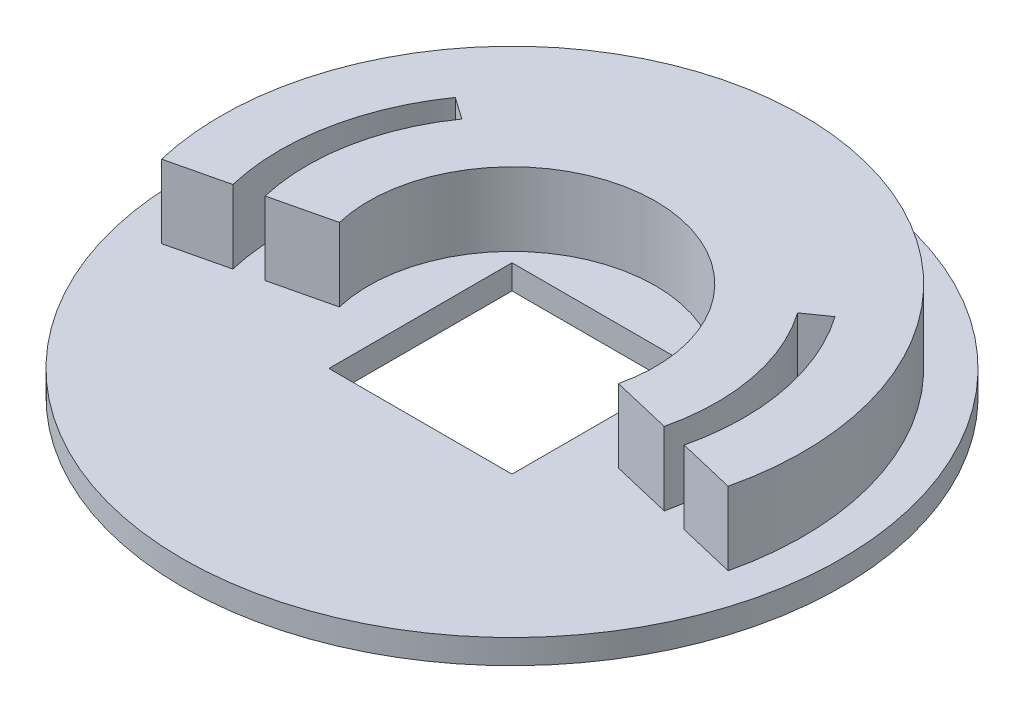
ISO-10303-21;
HEADER;
FILE_DESCRIPTION(('STEP AP214'),'2;1');
FILE_NAME('part.step','',(''),(''),'','','');
FILE_SCHEMA(('AUTOMOTIVE_DESIGN { 1 0 10303 214 1 1 1 1 }'));
ENDSEC;
DATA;
#1=APPLICATION_CONTEXT('core data for automotive mechanical design processes');
#2=APPLICATION_PROTOCOL_DEFINITION('international standard','automotive_design',2000,#1);
#3=PRODUCT_CONTEXT('',#1,'mechanical');
#4=PRODUCT('Part','Part','',(#3));
#5=PRODUCT_RELATED_PRODUCT_CATEGORY('part','',(#4));
#6=PRODUCT_DEFINITION_FORMATION('','',#4);
#7=PRODUCT_DEFINITION_CONTEXT('part definition',#1,'design');
#8=PRODUCT_DEFINITION('design','',#6,#7);
#9=PRODUCT_DEFINITION_SHAPE('','',#8);
#10=(LENGTH_UNIT() NAMED_UNIT(*) SI_UNIT(.MILLI.,.METRE.));
#11=(NAMED_UNIT(*) PLANE_ANGLE_UNIT() SI_UNIT($,.RADIAN.));
#12=(NAMED_UNIT(*) SI_UNIT($,.STERADIAN.) SOLID_ANGLE_UNIT());
#13=UNCERTAINTY_MEASURE_WITH_UNIT(LENGTH_MEASURE(1.E-05),#10,'distance_accuracy_value','');
#14=(GEOMETRIC_REPRESENTATION_CONTEXT(3) GLOBAL_UNCERTAINTY_ASSIGNED_CONTEXT((#13)) GLOBAL_UNIT_ASSIGNED_CONTEXT((#10,
#11,#12)) REPRESENTATION_CONTEXT('',''));
#15=CARTESIAN_POINT('',(0.,0.,0.));
#16=DIRECTION('',(0.,0.,1.));
#17=DIRECTION('',(1.,0.,0.));
#18=AXIS2_PLACEMENT_3D('',#15,#16,#17);
#19=CARTESIAN_POINT('',(23.207164841919,6.,5.5));
#20=DIRECTION('',(-0.230607966457023,0.,0.973046743895974));
#21=DIRECTION('',(0.973046743895974,0.,0.230607966457023));
#22=AXIS2_PLACEMENT_3D('',#19,#20,#21);
#23=PLANE('',#22);
#24=DIRECTION('',(-0.973046743895974,0.,-0.230607966457023));
#25=VECTOR('',#24,1.);
#26=CARTESIAN_POINT('',(23.207164841919,6.,5.5));
#27=LINE('',#26,#25);
#28=CARTESIAN_POINT('',(23.207164841919,6.,5.50000000000002));
#29=VERTEX_POINT('',#28);
#30=CARTESIAN_POINT('',(18.4878881340235,6.,4.38155136268344));
#31=VERTEX_POINT('',#30);
#32=EDGE_CURVE('E285',#29,#31,#27,.T.);
#33=ORIENTED_EDGE('',*,*,#32,.T.);
#34=DIRECTION('',(0.,1.,0.));
#35=VECTOR('',#34,1.);
#36=CARTESIAN_POINT('',(18.4878881340235,-16.1661900041716,4.38155136268344));
#37=LINE('',#36,#35);
#38=CARTESIAN_POINT('',(18.4878881340235,0.,4.38155136268344));
#39=VERTEX_POINT('',#38);
#40=EDGE_CURVE('E186',#39,#31,#37,.T.);
#41=ORIENTED_EDGE('',*,*,#40,.F.);
#42=DIRECTION('',(-0.973046743895974,0.,-0.230607966457023));
#43=VECTOR('',#42,1.);
#44=CARTESIAN_POINT('',(23.207164841919,0.,5.5));
#45=LINE('',#44,#43);
#46=CARTESIAN_POINT('',(23.207164841919,0.,5.50000000000002));
#47=VERTEX_POINT('',#46);
#48=EDGE_CURVE('E303',#47,#39,#45,.T.);
#49=ORIENTED_EDGE('',*,*,#48,.F.);
#50=DIRECTION('',(0.,-1.,0.));
#51=VECTOR('',#50,1.);
#52=CARTESIAN_POINT('',(23.207164841919,6.,5.50000000000002));
#53=LINE('',#52,#51);
#54=EDGE_CURVE('E312',#29,#47,#53,.T.);
#55=ORIENTED_EDGE('',*,*,#54,.F.);
#56=EDGE_LOOP('',(#33,#41,#49,#55));
#57=FACE_BOUND('',#56,.T.);
#58=ADVANCED_FACE('F39',(#57),#23,.T.);
#59=CARTESIAN_POINT('',(16.3471852974524,0.,3.87421383647799));
#60=VERTEX_POINT('',#59);
#61=CARTESIAN_POINT('',(11.4332992407777,0.,2.70964360587002));
#62=VERTEX_POINT('',#61);
#63=EDGE_CURVE('E302',#60,#62,#45,.T.);
#64=ORIENTED_EDGE('',*,*,#63,.F.);
#65=DIRECTION('',(0.,1.,0.));
#66=VECTOR('',#65,1.);
#67=CARTESIAN_POINT('',(16.3471852974524,-16.1661900041716,3.87421383647798));
#68=LINE('',#67,#66);
#69=CARTESIAN_POINT('',(16.3471852974524,6.,3.87421383647798));
#70=VERTEX_POINT('',#69);
#71=EDGE_CURVE('E55',#60,#70,#68,.T.);
#72=ORIENTED_EDGE('',*,*,#71,.T.);
#73=CARTESIAN_POINT('',(11.4332992407777,6.,2.70964360587002));
#74=VERTEX_POINT('',#73);
#75=EDGE_CURVE('E284',#70,#74,#27,.T.);
#76=ORIENTED_EDGE('',*,*,#75,.T.);
#77=DIRECTION('',(0.,-1.,0.));
#78=VECTOR('',#77,1.);
#79=CARTESIAN_POINT('',(11.4332992407777,6.,2.70964360587002));
#80=LINE('',#79,#78);
#81=EDGE_CURVE('E48',#74,#62,#80,.T.);
#82=ORIENTED_EDGE('',*,*,#81,.T.);
#83=EDGE_LOOP('',(#64,#72,#76,#82));
#84=FACE_BOUND('',#83,.T.);
#85=ADVANCED_FACE('F319',(#84),#23,.T.);
#86=CARTESIAN_POINT('',(0.,6.,0.));
#87=DIRECTION('',(0.,-1.,0.));
#88=DIRECTION('',(0.,0.,-1.));
#89=AXIS2_PLACEMENT_3D('',#86,#87,#88);
#90=PLANE('',#89);
#91=CARTESIAN_POINT('',(0.,6.,0.));
#92=DIRECTION('',(0.,-1.,0.));
#93=DIRECTION('',(0.,0.,-1.));
#94=AXIS2_PLACEMENT_3D('',#91,#92,#93);
#95=CIRCLE('',#94,19.);
#96=CARTESIAN_POINT('',(15.555508901638,6.,-10.909910302613));
#97=VERTEX_POINT('',#96);
#98=EDGE_CURVE('E183',#97,#31,#95,.T.);
#99=ORIENTED_EDGE('',*,*,#98,.T.);
#100=ORIENTED_EDGE('',*,*,#32,.F.);
#101=CARTESIAN_POINT('',(0.,6.,1.28369537222284E-13));
#102=DIRECTION('',(0.,-1.,0.));
#103=DIRECTION('',(0.,0.,-1.));
#104=AXIS2_PLACEMENT_3D('',#101,#102,#103);
#105=CIRCLE('',#104,23.85);
#106=CARTESIAN_POINT('',(-23.207164841919,6.,5.5));
#107=VERTEX_POINT('',#106);
#108=EDGE_CURVE('E289',#107,#29,#105,.T.);
#109=ORIENTED_EDGE('',*,*,#108,.F.);
#110=DIRECTION('',(0.973046743895974,0.,-0.230607966457023));
#111=VECTOR('',#110,1.);
#112=CARTESIAN_POINT('',(-23.207164841919,6.,5.5));
#113=LINE('',#112,#111);
#114=CARTESIAN_POINT('',(-18.4878881340235,6.,4.38155136268344));
#115=VERTEX_POINT('',#114);
#116=EDGE_CURVE('E275',#107,#115,#113,.T.);
#117=ORIENTED_EDGE('',*,*,#116,.T.);
#118=CARTESIAN_POINT('',(0.,6.,0.));
#119=DIRECTION('',(0.,1.,0.));
#120=DIRECTION('',(0.,0.,-1.));
#121=AXIS2_PLACEMENT_3D('',#118,#119,#120);
#122=CIRCLE('',#121,19.);
#123=CARTESIAN_POINT('',(-15.555508901638,6.,-10.909910302613));
#124=VERTEX_POINT('',#123);
#125=EDGE_CURVE('E175',#124,#115,#122,.T.);
#126=ORIENTED_EDGE('',*,*,#125,.F.);
#127=DIRECTION('',(-0.818710994823051,0.,-0.574205805400686));
#128=VECTOR('',#127,1.);
#129=CARTESIAN_POINT('',(-15.555508901638,6.,-10.909910302613));
#130=LINE('',#129,#128);
#131=CARTESIAN_POINT('',(-13.7543447130273,6.,-9.64665753073152));
#132=VERTEX_POINT('',#131);
#133=EDGE_CURVE('E194',#132,#124,#130,.T.);
#134=ORIENTED_EDGE('',*,*,#133,.F.);
#135=CARTESIAN_POINT('',(0.,6.,0.));
#136=DIRECTION('',(0.,-1.,0.));
#137=DIRECTION('',(0.,0.,-1.));
#138=AXIS2_PLACEMENT_3D('',#135,#136,#137);
#139=CIRCLE('',#138,16.8);
#140=CARTESIAN_POINT('',(-16.3471852974524,6.,3.87421383647798));
#141=VERTEX_POINT('',#140);
#142=EDGE_CURVE('E179',#141,#132,#139,.T.);
#143=ORIENTED_EDGE('',*,*,#142,.F.);
#144=CARTESIAN_POINT('',(-11.4332992407777,6.,2.70964360587002));
#145=VERTEX_POINT('',#144);
#146=EDGE_CURVE('E280',#141,#145,#113,.T.);
#147=ORIENTED_EDGE('',*,*,#146,.T.);
#148=CARTESIAN_POINT('',(0.,6.,0.));
#149=DIRECTION('',(0.,-1.,0.));
#150=DIRECTION('',(0.,0.,-1.));
#151=AXIS2_PLACEMENT_3D('',#148,#149,#150);
#152=CIRCLE('',#151,11.75);
#153=EDGE_CURVE('E279',#145,#74,#152,.T.);
#154=ORIENTED_EDGE('',*,*,#153,.T.);
#155=ORIENTED_EDGE('',*,*,#75,.F.);
#156=CARTESIAN_POINT('',(0.,6.,0.));
#157=DIRECTION('',(0.,1.,0.));
#158=DIRECTION('',(0.,0.,-1.));
#159=AXIS2_PLACEMENT_3D('',#156,#157,#158);
#160=CIRCLE('',#159,16.8);
#161=CARTESIAN_POINT('',(13.7543447130273,6.,-9.64665753073152));
#162=VERTEX_POINT('',#161);
#163=EDGE_CURVE('E162',#70,#162,#160,.T.);
#164=ORIENTED_EDGE('',*,*,#163,.T.);
#165=DIRECTION('',(0.818710994823051,0.,-0.574205805400686));
#166=VECTOR('',#165,1.);
#167=CARTESIAN_POINT('',(15.555508901638,6.,-10.909910302613));
#168=LINE('',#167,#166);
#169=EDGE_CURVE('E159',#162,#97,#168,.T.);
#170=ORIENTED_EDGE('',*,*,#169,.T.);
#171=EDGE_LOOP('',(#99,#100,#109,#117,#126,#134,#143,#147,#154,#155,#164,#170));
#172=FACE_BOUND('',#171,.T.);
#173=ADVANCED_FACE('F340',(#172),#90,.F.);
#174=CARTESIAN_POINT('',(-23.207164841919,6.,5.5));
#175=DIRECTION('',(-0.230607966457023,0.,-0.973046743895974));
#176=DIRECTION('',(-0.973046743895974,0.,0.230607966457023));
#177=AXIS2_PLACEMENT_3D('',#174,#175,#176);
#178=PLANE('',#177);
#179=ORIENTED_EDGE('',*,*,#146,.F.);
#180=DIRECTION('',(0.,1.,0.));
#181=VECTOR('',#180,1.);
#182=CARTESIAN_POINT('',(-16.3471852974524,-16.1661900041716,3.87421383647798));
#183=LINE('',#182,#181);
#184=CARTESIAN_POINT('',(-16.3471852974524,0.,3.87421383647798));
#185=VERTEX_POINT('',#184);
#186=EDGE_CURVE('E198',#185,#141,#183,.T.);
#187=ORIENTED_EDGE('',*,*,#186,.F.);
#188=DIRECTION('',(0.973046743895974,0.,-0.230607966457023));
#189=VECTOR('',#188,1.);
#190=CARTESIAN_POINT('',(-23.207164841919,0.,5.5));
#191=LINE('',#190,#189);
#192=CARTESIAN_POINT('',(-11.4332992407777,0.,2.70964360587002));
#193=VERTEX_POINT('',#192);
#194=EDGE_CURVE('E271',#185,#193,#191,.T.);
#195=ORIENTED_EDGE('',*,*,#194,.T.);
#196=DIRECTION('',(0.,-1.,0.));
#197=VECTOR('',#196,1.);
#198=CARTESIAN_POINT('',(-11.4332992407777,6.,2.70964360587002));
#199=LINE('',#198,#197);
#200=EDGE_CURVE('E11',#145,#193,#199,.T.);
#201=ORIENTED_EDGE('',*,*,#200,.F.);
#202=EDGE_LOOP('',(#179,#187,#195,#201));
#203=FACE_BOUND('',#202,.T.);
#204=ADVANCED_FACE('F332',(#203),#178,.F.);
#205=CARTESIAN_POINT('',(-23.207164841919,0.,5.5));
#206=VERTEX_POINT('',#205);
#207=CARTESIAN_POINT('',(-18.4878881340235,0.,4.38155136268344));
#208=VERTEX_POINT('',#207);
#209=EDGE_CURVE('E294',#206,#208,#191,.T.);
#210=ORIENTED_EDGE('',*,*,#209,.T.);
#211=DIRECTION('',(0.,1.,0.));
#212=VECTOR('',#211,1.);
#213=CARTESIAN_POINT('',(-18.4878881340235,-16.1661900041716,4.38155136268344));
#214=LINE('',#213,#212);
#215=EDGE_CURVE('E63',#208,#115,#214,.T.);
#216=ORIENTED_EDGE('',*,*,#215,.T.);
#217=ORIENTED_EDGE('',*,*,#116,.F.);
#218=DIRECTION('',(0.,-1.,0.));
#219=VECTOR('',#218,1.);
#220=CARTESIAN_POINT('',(-23.207164841919,6.,5.5));
#221=LINE('',#220,#219);
#222=EDGE_CURVE('E293',#107,#206,#221,.T.);
#223=ORIENTED_EDGE('',*,*,#222,.T.);
#224=EDGE_LOOP('',(#210,#216,#217,#223));
#225=FACE_BOUND('',#224,.T.);
#226=ADVANCED_FACE('F41',(#225),#178,.F.);
#227=CARTESIAN_POINT('',(0.,6.,0.));
#228=DIRECTION('',(0.,-1.,0.));
#229=DIRECTION('',(0.,0.,-1.));
#230=AXIS2_PLACEMENT_3D('',#227,#228,#229);
#231=CYLINDRICAL_SURFACE('',#230,11.75);
#232=CARTESIAN_POINT('',(0.,0.,0.));
#233=DIRECTION('',(0.,-1.,0.));
#234=DIRECTION('',(0.,0.,-1.));
#235=AXIS2_PLACEMENT_3D('',#232,#233,#234);
#236=CIRCLE('',#235,11.75);
#237=EDGE_CURVE('E298',#193,#62,#236,.T.);
#238=ORIENTED_EDGE('',*,*,#237,.T.);
#239=ORIENTED_EDGE('',*,*,#81,.F.);
#240=ORIENTED_EDGE('',*,*,#153,.F.);
#241=ORIENTED_EDGE('',*,*,#200,.T.);
#242=EDGE_LOOP('',(#238,#239,#240,#241));
#243=FACE_BOUND('',#242,.T.);
#244=ADVANCED_FACE('F324',(#243),#231,.F.);
#245=CARTESIAN_POINT('',(0.,6.,1.28369537222284E-13));
#246=DIRECTION('',(0.,-1.,0.));
#247=DIRECTION('',(0.,0.,-1.));
#248=AXIS2_PLACEMENT_3D('',#245,#246,#247);
#249=CYLINDRICAL_SURFACE('',#248,23.85);
#250=CARTESIAN_POINT('',(0.,0.,1.28369537222284E-13));
#251=DIRECTION('',(0.,-1.,0.));
#252=DIRECTION('',(0.,0.,-1.));
#253=AXIS2_PLACEMENT_3D('',#250,#251,#252);
#254=CIRCLE('',#253,23.85);
#255=EDGE_CURVE('E306',#206,#47,#254,.T.);
#256=ORIENTED_EDGE('',*,*,#255,.F.);
#257=ORIENTED_EDGE('',*,*,#222,.F.);
#258=ORIENTED_EDGE('',*,*,#108,.T.);
#259=ORIENTED_EDGE('',*,*,#54,.T.);
#260=EDGE_LOOP('',(#256,#257,#258,#259));
#261=FACE_BOUND('',#260,.T.);
#262=ADVANCED_FACE('F350',(#261),#249,.T.);
#263=CARTESIAN_POINT('',(0.,0.,0.));
#264=DIRECTION('',(0.,-1.,0.));
#265=DIRECTION('',(0.,0.,-1.));
#266=AXIS2_PLACEMENT_3D('',#263,#264,#265);
#267=PLANE('',#266);
#268=DIRECTION('',(0.,0.,1.));
#269=VECTOR('',#268,1.);
#270=CARTESIAN_POINT('',(7.5,0.,7.5));
#271=LINE('',#270,#269);
#272=CARTESIAN_POINT('',(7.5,0.,-7.5));
#273=VERTEX_POINT('',#272);
#274=CARTESIAN_POINT('',(7.5,0.,7.5));
#275=VERTEX_POINT('',#274);
#276=EDGE_CURVE('E223',#273,#275,#271,.T.);
#277=ORIENTED_EDGE('',*,*,#276,.T.);
#278=DIRECTION('',(-1.,0.,0.));
#279=VECTOR('',#278,1.);
#280=CARTESIAN_POINT('',(-7.5,0.,7.5));
#281=LINE('',#280,#279);
#282=CARTESIAN_POINT('',(-7.5,0.,7.5));
#283=VERTEX_POINT('',#282);
#284=EDGE_CURVE('E242',#275,#283,#281,.T.);
#285=ORIENTED_EDGE('',*,*,#284,.T.);
#286=DIRECTION('',(0.,0.,-1.));
#287=VECTOR('',#286,1.);
#288=CARTESIAN_POINT('',(-7.5,0.,7.5));
#289=LINE('',#288,#287);
#290=CARTESIAN_POINT('',(-7.5,0.,-7.5));
#291=VERTEX_POINT('',#290);
#292=EDGE_CURVE('E246',#283,#291,#289,.T.);
#293=ORIENTED_EDGE('',*,*,#292,.T.);
#294=DIRECTION('',(1.,0.,0.));
#295=VECTOR('',#294,1.);
#296=CARTESIAN_POINT('',(-7.5,0.,-7.5));
#297=LINE('',#296,#295);
#298=EDGE_CURVE('E228',#291,#273,#297,.T.);
#299=ORIENTED_EDGE('',*,*,#298,.T.);
#300=EDGE_LOOP('',(#277,#285,#293,#299));
#301=FACE_BOUND('',#300,.T.);
#302=CARTESIAN_POINT('',(0.,0.,0.));
#303=DIRECTION('',(0.,-1.,0.));
#304=DIRECTION('',(0.,0.,-1.));
#305=AXIS2_PLACEMENT_3D('',#302,#303,#304);
#306=CIRCLE('',#305,27.);
#307=CARTESIAN_POINT('',(0.,0.,-27.));
#308=VERTEX_POINT('',#307);
#309=EDGE_CURVE('E266',#308,#308,#306,.T.);
#310=ORIENTED_EDGE('',*,*,#309,.F.);
#311=EDGE_LOOP('',(#310));
#312=FACE_BOUND('',#311,.T.);
#313=ORIENTED_EDGE('',*,*,#209,.F.);
#314=ORIENTED_EDGE('',*,*,#255,.T.);
#315=ORIENTED_EDGE('',*,*,#48,.T.);
#316=CARTESIAN_POINT('',(0.,0.,0.));
#317=DIRECTION('',(0.,-1.,0.));
#318=DIRECTION('',(0.,0.,-1.));
#319=AXIS2_PLACEMENT_3D('',#316,#317,#318);
#320=CIRCLE('',#319,19.);
#321=CARTESIAN_POINT('',(15.555508901638,0.,-10.909910302613));
#322=VERTEX_POINT('',#321);
#323=EDGE_CURVE('E170',#322,#39,#320,.T.);
#324=ORIENTED_EDGE('',*,*,#323,.F.);
#325=DIRECTION('',(0.818710994823051,0.,-0.574205805400686));
#326=VECTOR('',#325,1.);
#327=CARTESIAN_POINT('',(15.555508901638,0.,-10.909910302613));
#328=LINE('',#327,#326);
#329=CARTESIAN_POINT('',(13.7543447130273,0.,-9.64665753073152));
#330=VERTEX_POINT('',#329);
#331=EDGE_CURVE('E157',#330,#322,#328,.T.);
#332=ORIENTED_EDGE('',*,*,#331,.F.);
#333=CARTESIAN_POINT('',(0.,0.,0.));
#334=DIRECTION('',(0.,-1.,0.));
#335=DIRECTION('',(0.,0.,-1.));
#336=AXIS2_PLACEMENT_3D('',#333,#334,#335);
#337=CIRCLE('',#336,16.8);
#338=EDGE_CURVE('E167',#60,#330,#337,.F.);
#339=ORIENTED_EDGE('',*,*,#338,.F.);
#340=ORIENTED_EDGE('',*,*,#63,.T.);
#341=ORIENTED_EDGE('',*,*,#237,.F.);
#342=ORIENTED_EDGE('',*,*,#194,.F.);
#343=CARTESIAN_POINT('',(0.,0.,0.));
#344=DIRECTION('',(0.,-1.,0.));
#345=DIRECTION('',(0.,0.,-1.));
#346=AXIS2_PLACEMENT_3D('',#343,#344,#345);
#347=CIRCLE('',#346,16.8);
#348=CARTESIAN_POINT('',(-13.7543447130273,0.,-9.64665753073152));
#349=VERTEX_POINT('',#348);
#350=EDGE_CURVE('E211',#185,#349,#347,.T.);
#351=ORIENTED_EDGE('',*,*,#350,.T.);
#352=DIRECTION('',(-0.818710994823051,0.,-0.574205805400686));
#353=VECTOR('',#352,1.);
#354=CARTESIAN_POINT('',(-15.555508901638,0.,-10.909910302613));
#355=LINE('',#354,#353);
#356=CARTESIAN_POINT('',(-15.555508901638,0.,-10.909910302613));
#357=VERTEX_POINT('',#356);
#358=EDGE_CURVE('E206',#349,#357,#355,.T.);
#359=ORIENTED_EDGE('',*,*,#358,.T.);
#360=CARTESIAN_POINT('',(0.,0.,0.));
#361=DIRECTION('',(0.,-1.,0.));
#362=DIRECTION('',(0.,0.,-1.));
#363=AXIS2_PLACEMENT_3D('',#360,#361,#362);
#364=CIRCLE('',#363,19.);
#365=EDGE_CURVE('E202',#357,#208,#364,.F.);
#366=ORIENTED_EDGE('',*,*,#365,.T.);
#367=EDGE_LOOP('',(#313,#314,#315,#324,#332,#339,#340,#341,#342,#351,#359,#366));
#368=FACE_BOUND('',#367,.T.);
#369=ADVANCED_FACE('F166',(#301,#312,#368),#267,.F.);
#370=CARTESIAN_POINT('',(0.,-2.,0.));
#371=DIRECTION('',(0.,-1.,0.));
#372=DIRECTION('',(0.,0.,-1.));
#373=AXIS2_PLACEMENT_3D('',#370,#371,#372);
#374=PLANE('',#373);
#375=CARTESIAN_POINT('',(0.,-2.,0.));
#376=DIRECTION('',(0.,-1.,0.));
#377=DIRECTION('',(0.,0.,-1.));
#378=AXIS2_PLACEMENT_3D('',#375,#376,#377);
#379=CIRCLE('',#378,27.);
#380=CARTESIAN_POINT('',(0.,-2.,-27.));
#381=VERTEX_POINT('',#380);
#382=EDGE_CURVE('E267',#381,#381,#379,.T.);
#383=ORIENTED_EDGE('',*,*,#382,.T.);
#384=EDGE_LOOP('',(#383));
#385=FACE_BOUND('',#384,.T.);
#386=DIRECTION('',(-1.,0.,0.));
#387=VECTOR('',#386,1.);
#388=CARTESIAN_POINT('',(-7.5,-2.,7.5));
#389=LINE('',#388,#387);
#390=CARTESIAN_POINT('',(7.5,-2.,7.5));
#391=VERTEX_POINT('',#390);
#392=CARTESIAN_POINT('',(-7.5,-2.,7.5));
#393=VERTEX_POINT('',#392);
#394=EDGE_CURVE('E227',#391,#393,#389,.T.);
#395=ORIENTED_EDGE('',*,*,#394,.F.);
#396=DIRECTION('',(0.,0.,1.));
#397=VECTOR('',#396,1.);
#398=CARTESIAN_POINT('',(7.5,-2.,7.5));
#399=LINE('',#398,#397);
#400=CARTESIAN_POINT('',(7.5,-2.,-7.5));
#401=VERTEX_POINT('',#400);
#402=EDGE_CURVE('E224',#401,#391,#399,.T.);
#403=ORIENTED_EDGE('',*,*,#402,.F.);
#404=DIRECTION('',(1.,0.,0.));
#405=VECTOR('',#404,1.);
#406=CARTESIAN_POINT('',(-7.5,-2.,-7.5));
#407=LINE('',#406,#405);
#408=CARTESIAN_POINT('',(-7.5,-2.,-7.5));
#409=VERTEX_POINT('',#408);
#410=EDGE_CURVE('E235',#409,#401,#407,.T.);
#411=ORIENTED_EDGE('',*,*,#410,.F.);
#412=DIRECTION('',(0.,0.,-1.));
#413=VECTOR('',#412,1.);
#414=CARTESIAN_POINT('',(-7.5,-2.,7.5));
#415=LINE('',#414,#413);
#416=EDGE_CURVE('E231',#393,#409,#415,.T.);
#417=ORIENTED_EDGE('',*,*,#416,.F.);
#418=EDGE_LOOP('',(#395,#403,#411,#417));
#419=FACE_BOUND('',#418,.T.);
#420=ADVANCED_FACE('F398',(#385,#419),#374,.T.);
#421=CARTESIAN_POINT('',(0.,-2.,0.));
#422=DIRECTION('',(0.,1.,0.));
#423=DIRECTION('',(0.,0.,1.));
#424=AXIS2_PLACEMENT_3D('',#421,#422,#423);
#425=CYLINDRICAL_SURFACE('',#424,27.);
#426=ORIENTED_EDGE('',*,*,#382,.F.);
#427=EDGE_LOOP('',(#426));
#428=FACE_BOUND('',#427,.T.);
#429=ORIENTED_EDGE('',*,*,#309,.T.);
#430=EDGE_LOOP('',(#429));
#431=FACE_BOUND('',#430,.T.);
#432=ADVANCED_FACE('F394',(#428,#431),#425,.T.);
#433=CARTESIAN_POINT('',(7.5,-2.,7.5));
#434=DIRECTION('',(-1.,0.,0.));
#435=DIRECTION('',(0.,0.,1.));
#436=AXIS2_PLACEMENT_3D('',#433,#434,#435);
#437=PLANE('',#436);
#438=ORIENTED_EDGE('',*,*,#276,.F.);
#439=DIRECTION('',(0.,1.,0.));
#440=VECTOR('',#439,1.);
#441=CARTESIAN_POINT('',(7.5,-2.,-7.5));
#442=LINE('',#441,#440);
#443=EDGE_CURVE('E238',#401,#273,#442,.T.);
#444=ORIENTED_EDGE('',*,*,#443,.F.);
#445=ORIENTED_EDGE('',*,*,#402,.T.);
#446=DIRECTION('',(0.,1.,0.));
#447=VECTOR('',#446,1.);
#448=CARTESIAN_POINT('',(7.5,-2.,7.5));
#449=LINE('',#448,#447);
#450=EDGE_CURVE('E262',#391,#275,#449,.T.);
#451=ORIENTED_EDGE('',*,*,#450,.T.);
#452=EDGE_LOOP('',(#438,#444,#445,#451));
#453=FACE_BOUND('',#452,.T.);
#454=ADVANCED_FACE('F397',(#453),#437,.T.);
#455=CARTESIAN_POINT('',(-7.5,-2.,7.5));
#456=DIRECTION('',(0.,0.,-1.));
#457=DIRECTION('',(-1.,0.,0.));
#458=AXIS2_PLACEMENT_3D('',#455,#456,#457);
#459=PLANE('',#458);
#460=ORIENTED_EDGE('',*,*,#284,.F.);
#461=ORIENTED_EDGE('',*,*,#450,.F.);
#462=ORIENTED_EDGE('',*,*,#394,.T.);
#463=DIRECTION('',(0.,1.,0.));
#464=VECTOR('',#463,1.);
#465=CARTESIAN_POINT('',(-7.5,-2.,7.5));
#466=LINE('',#465,#464);
#467=EDGE_CURVE('E259',#393,#283,#466,.T.);
#468=ORIENTED_EDGE('',*,*,#467,.T.);
#469=EDGE_LOOP('',(#460,#461,#462,#468));
#470=FACE_BOUND('',#469,.T.);
#471=ADVANCED_FACE('F408',(#470),#459,.T.);
#472=CARTESIAN_POINT('',(-7.5,-2.,7.5));
#473=DIRECTION('',(1.,0.,0.));
#474=DIRECTION('',(0.,0.,-1.));
#475=AXIS2_PLACEMENT_3D('',#472,#473,#474);
#476=PLANE('',#475);
#477=ORIENTED_EDGE('',*,*,#292,.F.);
#478=ORIENTED_EDGE('',*,*,#467,.F.);
#479=ORIENTED_EDGE('',*,*,#416,.T.);
#480=DIRECTION('',(0.,1.,0.));
#481=VECTOR('',#480,1.);
#482=CARTESIAN_POINT('',(-7.5,-2.,-7.5));
#483=LINE('',#482,#481);
#484=EDGE_CURVE('E256',#409,#291,#483,.T.);
#485=ORIENTED_EDGE('',*,*,#484,.T.);
#486=EDGE_LOOP('',(#477,#478,#479,#485));
#487=FACE_BOUND('',#486,.T.);
#488=ADVANCED_FACE('F412',(#487),#476,.T.);
#489=CARTESIAN_POINT('',(-7.5,-2.,-7.5));
#490=DIRECTION('',(0.,0.,1.));
#491=DIRECTION('',(1.,0.,0.));
#492=AXIS2_PLACEMENT_3D('',#489,#490,#491);
#493=PLANE('',#492);
#494=ORIENTED_EDGE('',*,*,#298,.F.);
#495=ORIENTED_EDGE('',*,*,#484,.F.);
#496=ORIENTED_EDGE('',*,*,#410,.T.);
#497=ORIENTED_EDGE('',*,*,#443,.T.);
#498=EDGE_LOOP('',(#494,#495,#496,#497));
#499=FACE_BOUND('',#498,.T.);
#500=ADVANCED_FACE('F416',(#499),#493,.T.);
#501=CARTESIAN_POINT('',(0.,-16.1661900041716,0.));
#502=DIRECTION('',(0.,1.,0.));
#503=DIRECTION('',(0.,0.,1.));
#504=AXIS2_PLACEMENT_3D('',#501,#502,#503);
#505=CYLINDRICAL_SURFACE('',#504,16.8);
#506=ORIENTED_EDGE('',*,*,#186,.T.);
#507=ORIENTED_EDGE('',*,*,#142,.T.);
#508=DIRECTION('',(0.,1.,0.));
#509=VECTOR('',#508,1.);
#510=CARTESIAN_POINT('',(-13.7543447130273,-16.1661900041716,-9.64665753073152));
#511=LINE('',#510,#509);
#512=EDGE_CURVE('E210',#349,#132,#511,.T.);
#513=ORIENTED_EDGE('',*,*,#512,.F.);
#514=ORIENTED_EDGE('',*,*,#350,.F.);
#515=EDGE_LOOP('',(#506,#507,#513,#514));
#516=FACE_BOUND('',#515,.T.);
#517=ADVANCED_FACE('F335',(#516),#505,.T.);
#518=CARTESIAN_POINT('',(-15.555508901638,-16.1661900041716,-10.909910302613));
#519=DIRECTION('',(0.574205805400686,0.,-0.818710994823051));
#520=DIRECTION('',(-0.818710994823051,0.,-0.574205805400686));
#521=AXIS2_PLACEMENT_3D('',#518,#519,#520);
#522=PLANE('',#521);
#523=ORIENTED_EDGE('',*,*,#512,.T.);
#524=ORIENTED_EDGE('',*,*,#133,.T.);
#525=DIRECTION('',(0.,1.,0.));
#526=VECTOR('',#525,1.);
#527=CARTESIAN_POINT('',(-15.555508901638,-16.1661900041716,-10.909910302613));
#528=LINE('',#527,#526);
#529=EDGE_CURVE('E205',#357,#124,#528,.T.);
#530=ORIENTED_EDGE('',*,*,#529,.F.);
#531=ORIENTED_EDGE('',*,*,#358,.F.);
#532=EDGE_LOOP('',(#523,#524,#530,#531));
#533=FACE_BOUND('',#532,.T.);
#534=ADVANCED_FACE('F344',(#533),#522,.F.);
#535=CARTESIAN_POINT('',(0.,-16.1661900041716,0.));
#536=DIRECTION('',(0.,1.,0.));
#537=DIRECTION('',(0.,0.,1.));
#538=AXIS2_PLACEMENT_3D('',#535,#536,#537);
#539=CYLINDRICAL_SURFACE('',#538,19.);
#540=ORIENTED_EDGE('',*,*,#529,.T.);
#541=ORIENTED_EDGE('',*,*,#125,.T.);
#542=ORIENTED_EDGE('',*,*,#215,.F.);
#543=ORIENTED_EDGE('',*,*,#365,.F.);
#544=EDGE_LOOP('',(#540,#541,#542,#543));
#545=FACE_BOUND('',#544,.T.);
#546=ADVANCED_FACE('F365',(#545),#539,.F.);
#547=CARTESIAN_POINT('',(0.,-16.1661900041716,0.));
#548=DIRECTION('',(0.,1.,0.));
#549=DIRECTION('',(0.,0.,1.));
#550=AXIS2_PLACEMENT_3D('',#547,#548,#549);
#551=CYLINDRICAL_SURFACE('',#550,19.);
#552=ORIENTED_EDGE('',*,*,#323,.T.);
#553=ORIENTED_EDGE('',*,*,#40,.T.);
#554=ORIENTED_EDGE('',*,*,#98,.F.);
#555=DIRECTION('',(0.,1.,0.));
#556=VECTOR('',#555,1.);
#557=CARTESIAN_POINT('',(15.555508901638,-16.1661900041716,-10.909910302613));
#558=LINE('',#557,#556);
#559=EDGE_CURVE('E191',#322,#97,#558,.T.);
#560=ORIENTED_EDGE('',*,*,#559,.F.);
#561=EDGE_LOOP('',(#552,#553,#554,#560));
#562=FACE_BOUND('',#561,.T.);
#563=ADVANCED_FACE('F357',(#562),#551,.F.);
#564=CARTESIAN_POINT('',(0.,-16.1661900041716,0.));
#565=DIRECTION('',(0.,1.,0.));
#566=DIRECTION('',(0.,0.,1.));
#567=AXIS2_PLACEMENT_3D('',#564,#565,#566);
#568=CYLINDRICAL_SURFACE('',#567,16.8);
#569=ORIENTED_EDGE('',*,*,#338,.T.);
#570=DIRECTION('',(0.,1.,0.));
#571=VECTOR('',#570,1.);
#572=CARTESIAN_POINT('',(13.7543447130273,-16.1661900041716,-9.64665753073152));
#573=LINE('',#572,#571);
#574=EDGE_CURVE('E154',#330,#162,#573,.T.);
#575=ORIENTED_EDGE('',*,*,#574,.T.);
#576=ORIENTED_EDGE('',*,*,#163,.F.);
#577=ORIENTED_EDGE('',*,*,#71,.F.);
#578=EDGE_LOOP('',(#569,#575,#576,#577));
#579=FACE_BOUND('',#578,.T.);
#580=ADVANCED_FACE('F173',(#579),#568,.T.);
#581=CARTESIAN_POINT('',(15.555508901638,-16.1661900041716,-10.909910302613));
#582=DIRECTION('',(0.574205805400686,0.,0.818710994823051));
#583=DIRECTION('',(0.818710994823051,0.,-0.574205805400686));
#584=AXIS2_PLACEMENT_3D('',#581,#582,#583);
#585=PLANE('',#584);
#586=ORIENTED_EDGE('',*,*,#331,.T.);
#587=ORIENTED_EDGE('',*,*,#559,.T.);
#588=ORIENTED_EDGE('',*,*,#169,.F.);
#589=ORIENTED_EDGE('',*,*,#574,.F.);
#590=EDGE_LOOP('',(#586,#587,#588,#589));
#591=FACE_BOUND('',#590,.T.);
#592=ADVANCED_FACE('F156',(#591),#585,.T.);
#593=CLOSED_SHELL('',(#58,#85,#173,#204,#226,#244,#262,#369,#420,#432,#454,#471,#488,#500,#517,
#534,#546,#563,#580,#592));
#594=MANIFOLD_SOLID_BREP('B2',#593);
#595=ADVANCED_BREP_SHAPE_REPRESENTATION('',(#18,#594),#14);
#596=SHAPE_DEFINITION_REPRESENTATION(#9,#595);
ENDSEC;
END-ISO-10303-21;
